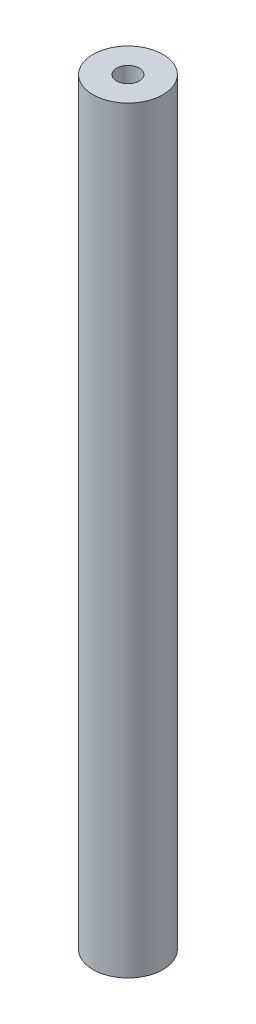
ISO-10303-21;
HEADER;
FILE_DESCRIPTION(('STEP AP214'),'2;1');
FILE_NAME('part.step','',(''),(''),'','','');
FILE_SCHEMA(('AUTOMOTIVE_DESIGN { 1 0 10303 214 1 1 1 1 }'));
ENDSEC;
DATA;
#1=APPLICATION_CONTEXT('core data for automotive mechanical design processes');
#2=APPLICATION_PROTOCOL_DEFINITION('international standard','automotive_design',2000,#1);
#3=PRODUCT_CONTEXT('',#1,'mechanical');
#4=PRODUCT('Part','Part','',(#3));
#5=PRODUCT_RELATED_PRODUCT_CATEGORY('part','',(#4));
#6=PRODUCT_DEFINITION_FORMATION('','',#4);
#7=PRODUCT_DEFINITION_CONTEXT('part definition',#1,'design');
#8=PRODUCT_DEFINITION('design','',#6,#7);
#9=PRODUCT_DEFINITION_SHAPE('','',#8);
#10=(LENGTH_UNIT() NAMED_UNIT(*) SI_UNIT(.MILLI.,.METRE.));
#11=(NAMED_UNIT(*) PLANE_ANGLE_UNIT() SI_UNIT($,.RADIAN.));
#12=(NAMED_UNIT(*) SI_UNIT($,.STERADIAN.) SOLID_ANGLE_UNIT());
#13=UNCERTAINTY_MEASURE_WITH_UNIT(LENGTH_MEASURE(1.E-05),#10,'distance_accuracy_value','');
#14=(GEOMETRIC_REPRESENTATION_CONTEXT(3) GLOBAL_UNCERTAINTY_ASSIGNED_CONTEXT((#13)) GLOBAL_UNIT_ASSIGNED_CONTEXT((#10,
#11,#12)) REPRESENTATION_CONTEXT('',''));
#15=CARTESIAN_POINT('',(0.,0.,0.));
#16=DIRECTION('',(0.,0.,1.));
#17=DIRECTION('',(1.,0.,0.));
#18=AXIS2_PLACEMENT_3D('',#15,#16,#17);
#19=CARTESIAN_POINT('',(-6.55355812846605,97.5,-4.91516859634954));
#20=DIRECTION('',(0.,-1.,0.));
#21=DIRECTION('',(0.,0.,-1.));
#22=AXIS2_PLACEMENT_3D('',#19,#20,#21);
#23=CYLINDRICAL_SURFACE('',#22,4.5);
#24=CARTESIAN_POINT('',(-6.55355812846605,97.5,-4.91516859634954));
#25=DIRECTION('',(0.,1.,0.));
#26=DIRECTION('',(0.,0.,1.));
#27=AXIS2_PLACEMENT_3D('',#24,#25,#26);
#28=CIRCLE('',#27,4.5);
#29=CARTESIAN_POINT('',(-6.55355812846605,97.5,-0.415168596349541));
#30=VERTEX_POINT('',#29);
#31=EDGE_CURVE('E10',#30,#30,#28,.T.);
#32=ORIENTED_EDGE('',*,*,#31,.F.);
#33=EDGE_LOOP('',(#32));
#34=FACE_BOUND('',#33,.T.);
#35=CARTESIAN_POINT('',(-6.55355812846605,0.,-4.91516859634954));
#36=DIRECTION('',(0.,1.,0.));
#37=DIRECTION('',(0.,0.,1.));
#38=AXIS2_PLACEMENT_3D('',#35,#36,#37);
#39=CIRCLE('',#38,4.5);
#40=CARTESIAN_POINT('',(-6.55355812846605,0.,-0.415168596349541));
#41=VERTEX_POINT('',#40);
#42=EDGE_CURVE('E44',#41,#41,#39,.T.);
#43=ORIENTED_EDGE('',*,*,#42,.T.);
#44=EDGE_LOOP('',(#43));
#45=FACE_BOUND('',#44,.T.);
#46=ADVANCED_FACE('F41',(#34,#45),#23,.T.);
#47=CARTESIAN_POINT('',(-6.55355812846605,97.5,-4.91516859634954));
#48=DIRECTION('',(0.,1.,0.));
#49=DIRECTION('',(0.,0.,1.));
#50=AXIS2_PLACEMENT_3D('',#47,#48,#49);
#51=PLANE('',#50);
#52=CARTESIAN_POINT('',(-6.55355812846605,97.5,-4.91516859634954));
#53=DIRECTION('',(0.,1.,0.));
#54=DIRECTION('',(0.,0.,1.));
#55=AXIS2_PLACEMENT_3D('',#52,#53,#54);
#56=CIRCLE('',#55,1.45);
#57=CARTESIAN_POINT('',(-6.55355812846605,97.5,-3.46516859634954));
#58=VERTEX_POINT('',#57);
#59=EDGE_CURVE('E55',#58,#58,#56,.T.);
#60=ORIENTED_EDGE('',*,*,#59,.F.);
#61=EDGE_LOOP('',(#60));
#62=FACE_BOUND('',#61,.T.);
#63=ORIENTED_EDGE('',*,*,#31,.T.);
#64=EDGE_LOOP('',(#63));
#65=FACE_BOUND('',#64,.T.);
#66=ADVANCED_FACE('F72',(#62,#65),#51,.T.);
#67=CARTESIAN_POINT('',(-6.55355812846605,0.,-4.91516859634954));
#68=DIRECTION('',(0.,1.,0.));
#69=DIRECTION('',(0.,0.,1.));
#70=AXIS2_PLACEMENT_3D('',#67,#68,#69);
#71=PLANE('',#70);
#72=CARTESIAN_POINT('',(-6.55355812846605,0.,-4.91516859634954));
#73=DIRECTION('',(0.,1.,0.));
#74=DIRECTION('',(0.,0.,1.));
#75=AXIS2_PLACEMENT_3D('',#72,#73,#74);
#76=CIRCLE('',#75,1.45);
#77=CARTESIAN_POINT('',(-6.55355812846605,0.,-3.46516859634954));
#78=VERTEX_POINT('',#77);
#79=EDGE_CURVE('E53',#78,#78,#76,.T.);
#80=ORIENTED_EDGE('',*,*,#79,.T.);
#81=EDGE_LOOP('',(#80));
#82=FACE_BOUND('',#81,.T.);
#83=ORIENTED_EDGE('',*,*,#42,.F.);
#84=EDGE_LOOP('',(#83));
#85=FACE_BOUND('',#84,.T.);
#86=ADVANCED_FACE('F63',(#82,#85),#71,.F.);
#87=CARTESIAN_POINT('',(-6.55355812846605,0.,-4.91516859634954));
#88=DIRECTION('',(0.,1.,0.));
#89=DIRECTION('',(0.,0.,1.));
#90=AXIS2_PLACEMENT_3D('',#87,#88,#89);
#91=CYLINDRICAL_SURFACE('',#90,1.45);
#92=ORIENTED_EDGE('',*,*,#79,.F.);
#93=EDGE_LOOP('',(#92));
#94=FACE_BOUND('',#93,.T.);
#95=ORIENTED_EDGE('',*,*,#59,.T.);
#96=EDGE_LOOP('',(#95));
#97=FACE_BOUND('',#96,.T.);
#98=ADVANCED_FACE('F66',(#94,#97),#91,.F.);
#99=CLOSED_SHELL('',(#46,#66,#86,#98));
#100=MANIFOLD_SOLID_BREP('B2',#99);
#101=ADVANCED_BREP_SHAPE_REPRESENTATION('',(#18,#100),#14);
#102=SHAPE_DEFINITION_REPRESENTATION(#9,#101);
ENDSEC;
END-ISO-10303-21;
